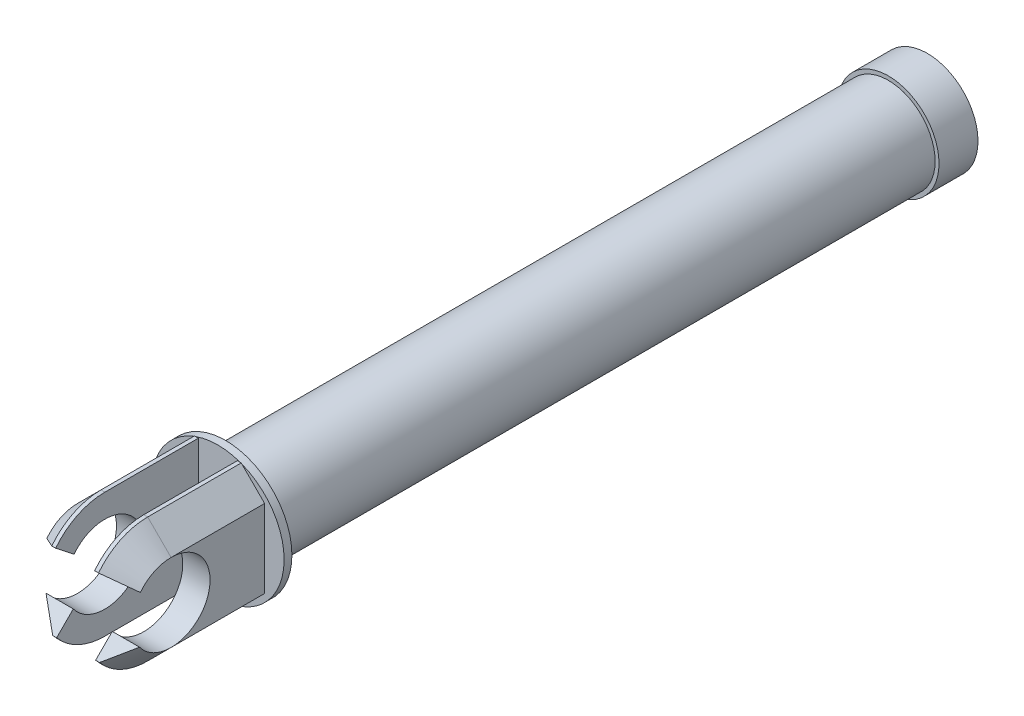
ISO-10303-21;
HEADER;
FILE_DESCRIPTION(('STEP AP214'),'2;1');
FILE_NAME('part.step','',(''),(''),'','','');
FILE_SCHEMA(('AUTOMOTIVE_DESIGN { 1 0 10303 214 1 1 1 1 }'));
ENDSEC;
DATA;
#1=APPLICATION_CONTEXT('core data for automotive mechanical design processes');
#2=APPLICATION_PROTOCOL_DEFINITION('international standard','automotive_design',2000,#1);
#3=PRODUCT_CONTEXT('',#1,'mechanical');
#4=PRODUCT('Part','Part','',(#3));
#5=PRODUCT_RELATED_PRODUCT_CATEGORY('part','',(#4));
#6=PRODUCT_DEFINITION_FORMATION('','',#4);
#7=PRODUCT_DEFINITION_CONTEXT('part definition',#1,'design');
#8=PRODUCT_DEFINITION('design','',#6,#7);
#9=PRODUCT_DEFINITION_SHAPE('','',#8);
#10=(LENGTH_UNIT() NAMED_UNIT(*) SI_UNIT(.MILLI.,.METRE.));
#11=(NAMED_UNIT(*) PLANE_ANGLE_UNIT() SI_UNIT($,.RADIAN.));
#12=(NAMED_UNIT(*) SI_UNIT($,.STERADIAN.) SOLID_ANGLE_UNIT());
#13=UNCERTAINTY_MEASURE_WITH_UNIT(LENGTH_MEASURE(1.E-05),#10,'distance_accuracy_value','');
#14=(GEOMETRIC_REPRESENTATION_CONTEXT(3) GLOBAL_UNCERTAINTY_ASSIGNED_CONTEXT((#13)) GLOBAL_UNIT_ASSIGNED_CONTEXT((#10,
#11,#12)) REPRESENTATION_CONTEXT('',''));
#15=CARTESIAN_POINT('',(0.,0.,0.));
#16=DIRECTION('',(0.,0.,1.));
#17=DIRECTION('',(1.,0.,0.));
#18=AXIS2_PLACEMENT_3D('',#15,#16,#17);
#19=CARTESIAN_POINT('',(12.,0.,206.));
#20=DIRECTION('',(-1.,0.,0.));
#21=DIRECTION('',(0.,0.,1.));
#22=AXIS2_PLACEMENT_3D('',#19,#20,#21);
#23=CYLINDRICAL_SURFACE('',#22,16.);
#24=CARTESIAN_POINT('',(4.99999999999997,0.,206.));
#25=DIRECTION('',(-1.,0.,0.));
#26=DIRECTION('',(0.,0.,1.));
#27=AXIS2_PLACEMENT_3D('',#24,#25,#26);
#28=CIRCLE('',#27,16.);
#29=CARTESIAN_POINT('',(4.99999999999997,9.85360260847751,218.605812771662));
#30=VERTEX_POINT('',#29);
#31=CARTESIAN_POINT('',(4.99999999999997,16.,206.));
#32=VERTEX_POINT('',#31);
#33=EDGE_CURVE('E397',#30,#32,#28,.T.);
#34=ORIENTED_EDGE('',*,*,#33,.F.);
#35=DIRECTION('',(1.,0.,0.));
#36=VECTOR('',#35,1.);
#37=CARTESIAN_POINT('',(-33.6006798410072,9.85360260847751,218.605812771662));
#38=LINE('',#37,#36);
#39=CARTESIAN_POINT('',(5.99999999999991,9.85360260847752,218.605812771662));
#40=VERTEX_POINT('',#39);
#41=EDGE_CURVE('E79',#30,#40,#38,.T.);
#42=ORIENTED_EDGE('',*,*,#41,.T.);
#43=CARTESIAN_POINT('',(5.99999999999997,0.,206.));
#44=DIRECTION('',(1.,0.,0.));
#45=DIRECTION('',(0.,0.,-1.));
#46=AXIS2_PLACEMENT_3D('',#43,#44,#45);
#47=CIRCLE('',#46,16.);
#48=CARTESIAN_POINT('',(5.99999999999997,16.,206.));
#49=VERTEX_POINT('',#48);
#50=EDGE_CURVE('E323',#40,#49,#47,.F.);
#51=ORIENTED_EDGE('',*,*,#50,.T.);
#52=DIRECTION('',(-1.,0.,0.));
#53=VECTOR('',#52,1.);
#54=CARTESIAN_POINT('',(12.,16.,206.));
#55=LINE('',#54,#53);
#56=EDGE_CURVE('E284',#49,#32,#55,.T.);
#57=ORIENTED_EDGE('',*,*,#56,.T.);
#58=EDGE_LOOP('',(#34,#42,#51,#57));
#59=FACE_BOUND('',#58,.T.);
#60=ADVANCED_FACE('F63',(#59),#23,.T.);
#61=CARTESIAN_POINT('',(-5.99999999999999,0.,206.));
#62=DIRECTION('',(1.,0.,0.));
#63=DIRECTION('',(0.,0.,-1.));
#64=AXIS2_PLACEMENT_3D('',#61,#62,#63);
#65=CIRCLE('',#64,16.);
#66=CARTESIAN_POINT('',(-5.99999999999999,16.,206.));
#67=VERTEX_POINT('',#66);
#68=CARTESIAN_POINT('',(-5.99999999999998,9.85360260847751,218.605812771662));
#69=VERTEX_POINT('',#68);
#70=EDGE_CURVE('E327',#67,#69,#65,.T.);
#71=ORIENTED_EDGE('',*,*,#70,.T.);
#72=CARTESIAN_POINT('',(-5.,9.85360260847751,218.605812771662));
#73=VERTEX_POINT('',#72);
#74=EDGE_CURVE('E505',#69,#73,#38,.T.);
#75=ORIENTED_EDGE('',*,*,#74,.T.);
#76=CARTESIAN_POINT('',(-5.,0.,206.));
#77=DIRECTION('',(-1.,0.,0.));
#78=DIRECTION('',(0.,0.,1.));
#79=AXIS2_PLACEMENT_3D('',#76,#77,#78);
#80=CIRCLE('',#79,16.);
#81=CARTESIAN_POINT('',(-5.,16.,206.));
#82=VERTEX_POINT('',#81);
#83=EDGE_CURVE('E390',#73,#82,#80,.T.);
#84=ORIENTED_EDGE('',*,*,#83,.T.);
#85=EDGE_CURVE('E283',#82,#67,#55,.T.);
#86=ORIENTED_EDGE('',*,*,#85,.T.);
#87=EDGE_LOOP('',(#71,#75,#84,#86));
#88=FACE_BOUND('',#87,.T.);
#89=ADVANCED_FACE('F504',(#88),#23,.T.);
#90=CARTESIAN_POINT('',(-5.99999999999999,0.,206.));
#91=DIRECTION('',(1.,0.,0.));
#92=DIRECTION('',(0.,0.,-1.));
#93=AXIS2_PLACEMENT_3D('',#90,#91,#92);
#94=CONICAL_SURFACE('',#93,16.,0.785398163397451);
#95=DIRECTION('',(0.707106781186546,0.435471826473245,0.557103480825653));
#96=VECTOR('',#95,1.);
#97=CARTESIAN_POINT('',(-21.9999999999999,0.,206.));
#98=LINE('',#97,#96);
#99=CARTESIAN_POINT('',(-12.,6.15850163029844,213.878632982289));
#100=VERTEX_POINT('',#99);
#101=EDGE_CURVE('E501',#69,#100,#98,.F.);
#102=ORIENTED_EDGE('',*,*,#101,.F.);
#103=ORIENTED_EDGE('',*,*,#70,.F.);
#104=DIRECTION('',(-0.707106781186546,-0.707106781186549,0.));
#105=VECTOR('',#104,1.);
#106=CARTESIAN_POINT('',(-5.99999999999999,16.,206.));
#107=LINE('',#106,#105);
#108=CARTESIAN_POINT('',(-12.,9.99999999999996,206.));
#109=VERTEX_POINT('',#108);
#110=EDGE_CURVE('E360',#67,#109,#107,.T.);
#111=ORIENTED_EDGE('',*,*,#110,.T.);
#112=CARTESIAN_POINT('',(-12.,0.,206.));
#113=DIRECTION('',(1.,0.,0.));
#114=DIRECTION('',(0.,0.,-1.));
#115=AXIS2_PLACEMENT_3D('',#112,#113,#114);
#116=CIRCLE('',#115,10.);
#117=EDGE_CURVE('E256',#109,#100,#116,.T.);
#118=ORIENTED_EDGE('',*,*,#117,.T.);
#119=EDGE_LOOP('',(#102,#103,#111,#118));
#120=FACE_BOUND('',#119,.T.);
#121=ADVANCED_FACE('F500',(#120),#94,.T.);
#122=CARTESIAN_POINT('',(12.,0.,206.));
#123=DIRECTION('',(-1.,0.,0.));
#124=DIRECTION('',(0.,0.,1.));
#125=AXIS2_PLACEMENT_3D('',#122,#123,#124);
#126=CONICAL_SURFACE('',#125,9.99999999999999,0.785398163397446);
#127=DIRECTION('',(0.707106781186549,-0.435471826473244,-0.55710348082565));
#128=VECTOR('',#127,1.);
#129=CARTESIAN_POINT('',(22.,0.,206.));
#130=LINE('',#129,#128);
#131=CARTESIAN_POINT('',(12.,6.15850163029844,213.878632982289));
#132=VERTEX_POINT('',#131);
#133=EDGE_CURVE('E419',#132,#40,#130,.F.);
#134=ORIENTED_EDGE('',*,*,#133,.F.);
#135=CARTESIAN_POINT('',(12.,0.,206.));
#136=DIRECTION('',(1.,0.,0.));
#137=DIRECTION('',(0.,0.,-1.));
#138=AXIS2_PLACEMENT_3D('',#135,#136,#137);
#139=CIRCLE('',#138,10.);
#140=CARTESIAN_POINT('',(12.,9.99999999999999,206.));
#141=VERTEX_POINT('',#140);
#142=EDGE_CURVE('E251',#141,#132,#139,.T.);
#143=ORIENTED_EDGE('',*,*,#142,.F.);
#144=DIRECTION('',(-0.707106781186549,0.707106781186546,0.));
#145=VECTOR('',#144,1.);
#146=CARTESIAN_POINT('',(12.,9.99999999999999,206.));
#147=LINE('',#146,#145);
#148=EDGE_CURVE('E361',#141,#49,#147,.T.);
#149=ORIENTED_EDGE('',*,*,#148,.T.);
#150=ORIENTED_EDGE('',*,*,#50,.F.);
#151=EDGE_LOOP('',(#134,#143,#149,#150));
#152=FACE_BOUND('',#151,.T.);
#153=ADVANCED_FACE('F417',(#152),#126,.T.);
#154=CARTESIAN_POINT('',(12.,16.,182.));
#155=DIRECTION('',(0.,-1.,0.));
#156=DIRECTION('',(0.,0.,-1.));
#157=AXIS2_PLACEMENT_3D('',#154,#155,#156);
#158=PLANE('',#157);
#159=DIRECTION('',(0.,0.,-1.));
#160=VECTOR('',#159,1.);
#161=CARTESIAN_POINT('',(4.99999999999996,16.,182.));
#162=LINE('',#161,#160);
#163=CARTESIAN_POINT('',(4.99999999999996,16.,182.));
#164=VERTEX_POINT('',#163);
#165=EDGE_CURVE('E259',#32,#164,#162,.T.);
#166=ORIENTED_EDGE('',*,*,#165,.F.);
#167=ORIENTED_EDGE('',*,*,#56,.F.);
#168=DIRECTION('',(0.,0.,-1.));
#169=VECTOR('',#168,1.);
#170=CARTESIAN_POINT('',(5.99999999999997,16.,182.));
#171=LINE('',#170,#169);
#172=CARTESIAN_POINT('',(5.99999999999997,16.,182.));
#173=VERTEX_POINT('',#172);
#174=EDGE_CURVE('E330',#49,#173,#171,.T.);
#175=ORIENTED_EDGE('',*,*,#174,.T.);
#176=DIRECTION('',(-1.,0.,0.));
#177=VECTOR('',#176,1.);
#178=CARTESIAN_POINT('',(12.,16.,182.));
#179=LINE('',#178,#177);
#180=CARTESIAN_POINT('',(5.74456264653805,16.,182.));
#181=VERTEX_POINT('',#180);
#182=EDGE_CURVE('E288',#173,#181,#179,.T.);
#183=ORIENTED_EDGE('',*,*,#182,.T.);
#184=EDGE_CURVE('E274',#181,#164,#179,.T.);
#185=ORIENTED_EDGE('',*,*,#184,.T.);
#186=EDGE_LOOP('',(#166,#167,#175,#183,#185));
#187=FACE_BOUND('',#186,.T.);
#188=ADVANCED_FACE('F411',(#187),#158,.F.);
#189=CARTESIAN_POINT('',(5.99999999999997,-16.,206.));
#190=VERTEX_POINT('',#189);
#191=CARTESIAN_POINT('',(5.99999999999998,-10.1622103242348,218.358376969733));
#192=VERTEX_POINT('',#191);
#193=EDGE_CURVE('E324',#190,#192,#47,.F.);
#194=ORIENTED_EDGE('',*,*,#193,.T.);
#195=DIRECTION('',(1.,0.,0.));
#196=VECTOR('',#195,1.);
#197=CARTESIAN_POINT('',(-33.6006798410072,-10.1622103242348,218.358376969733));
#198=LINE('',#197,#196);
#199=CARTESIAN_POINT('',(4.99999999999996,-10.1622103242348,218.358376969733));
#200=VERTEX_POINT('',#199);
#201=EDGE_CURVE('E226',#200,#192,#198,.T.);
#202=ORIENTED_EDGE('',*,*,#201,.F.);
#203=CARTESIAN_POINT('',(4.99999999999997,-16.,206.));
#204=VERTEX_POINT('',#203);
#205=EDGE_CURVE('E398',#204,#200,#28,.T.);
#206=ORIENTED_EDGE('',*,*,#205,.F.);
#207=DIRECTION('',(-1.,0.,0.));
#208=VECTOR('',#207,1.);
#209=CARTESIAN_POINT('',(12.,-16.,206.));
#210=LINE('',#209,#208);
#211=EDGE_CURVE('E280',#190,#204,#210,.T.);
#212=ORIENTED_EDGE('',*,*,#211,.F.);
#213=EDGE_LOOP('',(#194,#202,#206,#212));
#214=FACE_BOUND('',#213,.T.);
#215=ADVANCED_FACE('F555',(#214),#23,.T.);
#216=CARTESIAN_POINT('',(12.,-16.,206.));
#217=DIRECTION('',(0.,1.,0.));
#218=DIRECTION('',(0.,0.,1.));
#219=AXIS2_PLACEMENT_3D('',#216,#217,#218);
#220=PLANE('',#219);
#221=DIRECTION('',(0.,0.,1.));
#222=VECTOR('',#221,1.);
#223=CARTESIAN_POINT('',(4.99999999999997,-16.,206.));
#224=LINE('',#223,#222);
#225=CARTESIAN_POINT('',(4.99999999999996,-16.,182.));
#226=VERTEX_POINT('',#225);
#227=EDGE_CURVE('E372',#226,#204,#224,.T.);
#228=ORIENTED_EDGE('',*,*,#227,.F.);
#229=DIRECTION('',(-1.,0.,0.));
#230=VECTOR('',#229,1.);
#231=CARTESIAN_POINT('',(12.,-16.,182.));
#232=LINE('',#231,#230);
#233=CARTESIAN_POINT('',(5.74456264653805,-16.,182.));
#234=VERTEX_POINT('',#233);
#235=EDGE_CURVE('E269',#234,#226,#232,.T.);
#236=ORIENTED_EDGE('',*,*,#235,.F.);
#237=CARTESIAN_POINT('',(5.99999999999997,-16.,182.));
#238=VERTEX_POINT('',#237);
#239=EDGE_CURVE('E275',#238,#234,#232,.T.);
#240=ORIENTED_EDGE('',*,*,#239,.F.);
#241=DIRECTION('',(0.,0.,1.));
#242=VECTOR('',#241,1.);
#243=CARTESIAN_POINT('',(5.99999999999997,-16.,206.));
#244=LINE('',#243,#242);
#245=EDGE_CURVE('E273',#238,#190,#244,.T.);
#246=ORIENTED_EDGE('',*,*,#245,.T.);
#247=ORIENTED_EDGE('',*,*,#211,.T.);
#248=EDGE_LOOP('',(#228,#236,#240,#246,#247));
#249=FACE_BOUND('',#248,.T.);
#250=ADVANCED_FACE('F452',(#249),#220,.F.);
#251=CARTESIAN_POINT('',(12.,0.,206.));
#252=DIRECTION('',(-1.,0.,0.));
#253=DIRECTION('',(0.,0.,1.));
#254=AXIS2_PLACEMENT_3D('',#251,#252,#253);
#255=CYLINDRICAL_SURFACE('',#254,10.);
#256=DIRECTION('',(1.,0.,0.));
#257=VECTOR('',#256,1.);
#258=CARTESIAN_POINT('',(-33.6006798410072,6.15850163029844,213.878632982289));
#259=LINE('',#258,#257);
#260=CARTESIAN_POINT('',(4.99999999999996,6.15850163029844,213.878632982289));
#261=VERTEX_POINT('',#260);
#262=EDGE_CURVE('E612',#261,#132,#259,.T.);
#263=ORIENTED_EDGE('',*,*,#262,.F.);
#264=CARTESIAN_POINT('',(4.99999999999997,0.,206.));
#265=DIRECTION('',(-1.,0.,0.));
#266=DIRECTION('',(0.,0.,1.));
#267=AXIS2_PLACEMENT_3D('',#264,#265,#266);
#268=CIRCLE('',#267,10.);
#269=CARTESIAN_POINT('',(4.99999999999997,-5.88720214144661,214.083368786944));
#270=VERTEX_POINT('',#269);
#271=EDGE_CURVE('E242',#261,#270,#268,.T.);
#272=ORIENTED_EDGE('',*,*,#271,.T.);
#273=DIRECTION('',(1.,0.,0.));
#274=VECTOR('',#273,1.);
#275=CARTESIAN_POINT('',(-33.6006798410072,-5.8872021414466,214.083368786944));
#276=LINE('',#275,#274);
#277=CARTESIAN_POINT('',(12.,-5.8872021414466,214.083368786944));
#278=VERTEX_POINT('',#277);
#279=EDGE_CURVE('E87',#270,#278,#276,.T.);
#280=ORIENTED_EDGE('',*,*,#279,.T.);
#281=CARTESIAN_POINT('',(12.,-10.,206.));
#282=VERTEX_POINT('',#281);
#283=EDGE_CURVE('E239',#278,#282,#139,.T.);
#284=ORIENTED_EDGE('',*,*,#283,.T.);
#285=EDGE_CURVE('E252',#282,#141,#139,.T.);
#286=ORIENTED_EDGE('',*,*,#285,.T.);
#287=ORIENTED_EDGE('',*,*,#142,.T.);
#288=EDGE_LOOP('',(#263,#272,#280,#284,#286,#287));
#289=FACE_BOUND('',#288,.T.);
#290=ADVANCED_FACE('F237',(#289),#255,.F.);
#291=CARTESIAN_POINT('',(0.,0.,182.));
#292=DIRECTION('',(0.,0.,1.));
#293=DIRECTION('',(1.,0.,0.));
#294=AXIS2_PLACEMENT_3D('',#291,#292,#293);
#295=PLANE('',#294);
#296=CARTESIAN_POINT('',(0.,0.,182.));
#297=DIRECTION('',(0.,0.,1.));
#298=DIRECTION('',(1.,0.,0.));
#299=AXIS2_PLACEMENT_3D('',#296,#297,#298);
#300=CIRCLE('',#299,17.);
#301=CARTESIAN_POINT('',(-6.15232014258365,15.8476798574163,182.));
#302=VERTEX_POINT('',#301);
#303=CARTESIAN_POINT('',(-6.15232014258365,-15.8476798574163,182.));
#304=VERTEX_POINT('',#303);
#305=EDGE_CURVE('E459',#302,#304,#300,.T.);
#306=ORIENTED_EDGE('',*,*,#305,.T.);
#307=DIRECTION('',(0.707106781186546,-0.707106781186549,0.));
#308=VECTOR('',#307,1.);
#309=CARTESIAN_POINT('',(-5.99999999999999,-16.,182.));
#310=LINE('',#309,#308);
#311=CARTESIAN_POINT('',(-12.,-9.99999999999996,182.));
#312=VERTEX_POINT('',#311);
#313=EDGE_CURVE('E347',#304,#312,#310,.F.);
#314=ORIENTED_EDGE('',*,*,#313,.T.);
#315=DIRECTION('',(0.,1.,0.));
#316=VECTOR('',#315,1.);
#317=CARTESIAN_POINT('',(-12.,-16.,182.));
#318=LINE('',#317,#316);
#319=CARTESIAN_POINT('',(-12.,9.99999999999996,182.));
#320=VERTEX_POINT('',#319);
#321=EDGE_CURVE('E270',#312,#320,#318,.T.);
#322=ORIENTED_EDGE('',*,*,#321,.T.);
#323=DIRECTION('',(-0.707106781186546,-0.707106781186549,0.));
#324=VECTOR('',#323,1.);
#325=CARTESIAN_POINT('',(-5.99999999999999,16.,182.));
#326=LINE('',#325,#324);
#327=EDGE_CURVE('E349',#320,#302,#326,.F.);
#328=ORIENTED_EDGE('',*,*,#327,.T.);
#329=EDGE_LOOP('',(#306,#314,#322,#328));
#330=FACE_BOUND('',#329,.T.);
#331=ADVANCED_FACE('F487',(#330),#295,.T.);
#332=CARTESIAN_POINT('',(-5.74456264653805,-16.,182.));
#333=VERTEX_POINT('',#332);
#334=EDGE_CURVE('E458',#333,#234,#300,.T.);
#335=ORIENTED_EDGE('',*,*,#334,.T.);
#336=ORIENTED_EDGE('',*,*,#235,.T.);
#337=DIRECTION('',(0.,1.,0.));
#338=VECTOR('',#337,1.);
#339=CARTESIAN_POINT('',(4.99999999999996,-20.,182.));
#340=LINE('',#339,#338);
#341=EDGE_CURVE('E371',#226,#164,#340,.T.);
#342=ORIENTED_EDGE('',*,*,#341,.T.);
#343=ORIENTED_EDGE('',*,*,#184,.F.);
#344=CARTESIAN_POINT('',(-5.74456264653805,16.,182.));
#345=VERTEX_POINT('',#344);
#346=EDGE_CURVE('E295',#181,#345,#300,.T.);
#347=ORIENTED_EDGE('',*,*,#346,.T.);
#348=CARTESIAN_POINT('',(-5.,16.,182.));
#349=VERTEX_POINT('',#348);
#350=EDGE_CURVE('E268',#349,#345,#179,.T.);
#351=ORIENTED_EDGE('',*,*,#350,.F.);
#352=DIRECTION('',(0.,1.,0.));
#353=VECTOR('',#352,1.);
#354=CARTESIAN_POINT('',(-5.,-20.,182.));
#355=LINE('',#354,#353);
#356=CARTESIAN_POINT('',(-5.,-16.,182.));
#357=VERTEX_POINT('',#356);
#358=EDGE_CURVE('E506',#357,#349,#355,.T.);
#359=ORIENTED_EDGE('',*,*,#358,.F.);
#360=EDGE_CURVE('E279',#357,#333,#232,.T.);
#361=ORIENTED_EDGE('',*,*,#360,.T.);
#362=EDGE_LOOP('',(#335,#336,#342,#343,#347,#351,#359,#361));
#363=FACE_BOUND('',#362,.T.);
#364=ADVANCED_FACE('F471',(#363),#295,.T.);
#365=CARTESIAN_POINT('',(0.,0.,0.));
#366=DIRECTION('',(0.,0.,1.));
#367=DIRECTION('',(1.,0.,0.));
#368=AXIS2_PLACEMENT_3D('',#365,#366,#367);
#369=PLANE('',#368);
#370=CARTESIAN_POINT('',(0.,0.,0.));
#371=DIRECTION('',(0.,0.,1.));
#372=DIRECTION('',(1.,0.,0.));
#373=AXIS2_PLACEMENT_3D('',#370,#371,#372);
#374=CIRCLE('',#373,13.);
#375=CARTESIAN_POINT('',(13.,0.,0.));
#376=VERTEX_POINT('',#375);
#377=EDGE_CURVE('E302',#376,#376,#374,.T.);
#378=ORIENTED_EDGE('',*,*,#377,.F.);
#379=EDGE_LOOP('',(#378));
#380=FACE_BOUND('',#379,.T.);
#381=ADVANCED_FACE('F577',(#380),#369,.F.);
#382=CARTESIAN_POINT('',(0.,0.,10.));
#383=DIRECTION('',(0.,0.,-1.));
#384=DIRECTION('',(-1.,0.,0.));
#385=AXIS2_PLACEMENT_3D('',#382,#383,#384);
#386=CYLINDRICAL_SURFACE('',#385,13.);
#387=CARTESIAN_POINT('',(0.,0.,10.));
#388=DIRECTION('',(0.,0.,1.));
#389=DIRECTION('',(1.,0.,0.));
#390=AXIS2_PLACEMENT_3D('',#387,#388,#389);
#391=CIRCLE('',#390,13.);
#392=CARTESIAN_POINT('',(13.,0.,10.));
#393=VERTEX_POINT('',#392);
#394=EDGE_CURVE('E306',#393,#393,#391,.T.);
#395=ORIENTED_EDGE('',*,*,#394,.F.);
#396=EDGE_LOOP('',(#395));
#397=FACE_BOUND('',#396,.T.);
#398=ORIENTED_EDGE('',*,*,#377,.T.);
#399=EDGE_LOOP('',(#398));
#400=FACE_BOUND('',#399,.T.);
#401=ADVANCED_FACE('F575',(#397,#400),#386,.T.);
#402=CARTESIAN_POINT('',(0.,0.,10.));
#403=DIRECTION('',(0.,0.,1.));
#404=DIRECTION('',(1.,0.,0.));
#405=AXIS2_PLACEMENT_3D('',#402,#403,#404);
#406=PLANE('',#405);
#407=CARTESIAN_POINT('',(0.,0.,10.));
#408=DIRECTION('',(0.,0.,1.));
#409=DIRECTION('',(1.,0.,0.));
#410=AXIS2_PLACEMENT_3D('',#407,#408,#409);
#411=CIRCLE('',#410,12.);
#412=CARTESIAN_POINT('',(12.,0.,10.));
#413=VERTEX_POINT('',#412);
#414=EDGE_CURVE('E303',#413,#413,#411,.T.);
#415=ORIENTED_EDGE('',*,*,#414,.F.);
#416=EDGE_LOOP('',(#415));
#417=FACE_BOUND('',#416,.T.);
#418=ORIENTED_EDGE('',*,*,#394,.T.);
#419=EDGE_LOOP('',(#418));
#420=FACE_BOUND('',#419,.T.);
#421=ADVANCED_FACE('F571',(#417,#420),#406,.T.);
#422=CARTESIAN_POINT('',(0.,0.,180.));
#423=DIRECTION('',(0.,0.,-1.));
#424=DIRECTION('',(-1.,0.,0.));
#425=AXIS2_PLACEMENT_3D('',#422,#423,#424);
#426=CYLINDRICAL_SURFACE('',#425,12.);
#427=CARTESIAN_POINT('',(0.,0.,180.));
#428=DIRECTION('',(0.,0.,1.));
#429=DIRECTION('',(1.,0.,0.));
#430=AXIS2_PLACEMENT_3D('',#427,#428,#429);
#431=CIRCLE('',#430,12.);
#432=CARTESIAN_POINT('',(12.,0.,180.));
#433=VERTEX_POINT('',#432);
#434=EDGE_CURVE('E294',#433,#433,#431,.T.);
#435=ORIENTED_EDGE('',*,*,#434,.F.);
#436=EDGE_LOOP('',(#435));
#437=FACE_BOUND('',#436,.T.);
#438=ORIENTED_EDGE('',*,*,#414,.T.);
#439=EDGE_LOOP('',(#438));
#440=FACE_BOUND('',#439,.T.);
#441=ADVANCED_FACE('F568',(#437,#440),#426,.T.);
#442=CARTESIAN_POINT('',(0.,0.,182.));
#443=DIRECTION('',(0.,0.,-1.));
#444=DIRECTION('',(-1.,0.,0.));
#445=AXIS2_PLACEMENT_3D('',#442,#443,#444);
#446=CYLINDRICAL_SURFACE('',#445,17.);
#447=CARTESIAN_POINT('',(6.1523201425836,15.8476798574164,182.));
#448=VERTEX_POINT('',#447);
#449=EDGE_CURVE('E292',#448,#181,#300,.T.);
#450=ORIENTED_EDGE('',*,*,#449,.F.);
#451=CARTESIAN_POINT('',(6.1523201425836,-15.8476798574164,182.));
#452=VERTEX_POINT('',#451);
#453=EDGE_CURVE('E299',#452,#448,#300,.T.);
#454=ORIENTED_EDGE('',*,*,#453,.F.);
#455=EDGE_CURVE('E449',#234,#452,#300,.T.);
#456=ORIENTED_EDGE('',*,*,#455,.F.);
#457=ORIENTED_EDGE('',*,*,#334,.F.);
#458=EDGE_CURVE('E296',#304,#333,#300,.T.);
#459=ORIENTED_EDGE('',*,*,#458,.F.);
#460=ORIENTED_EDGE('',*,*,#305,.F.);
#461=EDGE_CURVE('E464',#345,#302,#300,.T.);
#462=ORIENTED_EDGE('',*,*,#461,.F.);
#463=ORIENTED_EDGE('',*,*,#346,.F.);
#464=EDGE_LOOP('',(#450,#454,#456,#457,#459,#460,#462,#463));
#465=FACE_BOUND('',#464,.T.);
#466=CARTESIAN_POINT('',(0.,0.,180.));
#467=DIRECTION('',(0.,0.,1.));
#468=DIRECTION('',(1.,0.,0.));
#469=AXIS2_PLACEMENT_3D('',#466,#467,#468);
#470=CIRCLE('',#469,17.);
#471=CARTESIAN_POINT('',(17.,0.,180.));
#472=VERTEX_POINT('',#471);
#473=EDGE_CURVE('E291',#472,#472,#470,.T.);
#474=ORIENTED_EDGE('',*,*,#473,.T.);
#475=EDGE_LOOP('',(#474));
#476=FACE_BOUND('',#475,.T.);
#477=ADVANCED_FACE('F431',(#465,#476),#446,.T.);
#478=DIRECTION('',(0.,1.,0.));
#479=VECTOR('',#478,1.);
#480=CARTESIAN_POINT('',(12.,-16.,182.));
#481=LINE('',#480,#479);
#482=CARTESIAN_POINT('',(12.,-9.99999999999999,182.));
#483=VERTEX_POINT('',#482);
#484=CARTESIAN_POINT('',(12.,9.99999999999999,182.));
#485=VERTEX_POINT('',#484);
#486=EDGE_CURVE('E265',#483,#485,#481,.T.);
#487=ORIENTED_EDGE('',*,*,#486,.F.);
#488=DIRECTION('',(-0.707106781186549,-0.707106781186546,0.));
#489=VECTOR('',#488,1.);
#490=CARTESIAN_POINT('',(12.,-9.99999999999999,182.));
#491=LINE('',#490,#489);
#492=EDGE_CURVE('E352',#483,#452,#491,.T.);
#493=ORIENTED_EDGE('',*,*,#492,.T.);
#494=ORIENTED_EDGE('',*,*,#453,.T.);
#495=DIRECTION('',(0.707106781186549,-0.707106781186546,0.));
#496=VECTOR('',#495,1.);
#497=CARTESIAN_POINT('',(12.,9.99999999999999,182.));
#498=LINE('',#497,#496);
#499=EDGE_CURVE('E355',#448,#485,#498,.T.);
#500=ORIENTED_EDGE('',*,*,#499,.T.);
#501=EDGE_LOOP('',(#487,#493,#494,#500));
#502=FACE_BOUND('',#501,.T.);
#503=ADVANCED_FACE('F438',(#502),#295,.T.);
#504=CARTESIAN_POINT('',(0.,0.,180.));
#505=DIRECTION('',(0.,0.,1.));
#506=DIRECTION('',(1.,0.,0.));
#507=AXIS2_PLACEMENT_3D('',#504,#505,#506);
#508=PLANE('',#507);
#509=ORIENTED_EDGE('',*,*,#434,.T.);
#510=EDGE_LOOP('',(#509));
#511=FACE_BOUND('',#510,.T.);
#512=ORIENTED_EDGE('',*,*,#473,.F.);
#513=EDGE_LOOP('',(#512));
#514=FACE_BOUND('',#513,.T.);
#515=ADVANCED_FACE('F560',(#511,#514),#508,.F.);
#516=CARTESIAN_POINT('',(12.,-16.,182.));
#517=DIRECTION('',(0.,0.,1.));
#518=DIRECTION('',(1.,0.,0.));
#519=AXIS2_PLACEMENT_3D('',#516,#517,#518);
#520=PLANE('',#519);
#521=ORIENTED_EDGE('',*,*,#182,.F.);
#522=DIRECTION('',(0.707106781186549,-0.707106781186546,0.));
#523=VECTOR('',#522,1.);
#524=CARTESIAN_POINT('',(12.,9.99999999999999,182.));
#525=LINE('',#524,#523);
#526=EDGE_CURVE('E344',#173,#448,#525,.T.);
#527=ORIENTED_EDGE('',*,*,#526,.T.);
#528=ORIENTED_EDGE('',*,*,#449,.T.);
#529=EDGE_LOOP('',(#521,#527,#528));
#530=FACE_BOUND('',#529,.T.);
#531=ADVANCED_FACE('F427',(#530),#520,.F.);
#532=ORIENTED_EDGE('',*,*,#461,.T.);
#533=DIRECTION('',(-0.707106781186546,-0.707106781186549,0.));
#534=VECTOR('',#533,1.);
#535=CARTESIAN_POINT('',(-5.99999999999999,16.,182.));
#536=LINE('',#535,#534);
#537=CARTESIAN_POINT('',(-5.99999999999999,16.,182.));
#538=VERTEX_POINT('',#537);
#539=EDGE_CURVE('E335',#302,#538,#536,.F.);
#540=ORIENTED_EDGE('',*,*,#539,.T.);
#541=EDGE_CURVE('E287',#345,#538,#179,.T.);
#542=ORIENTED_EDGE('',*,*,#541,.F.);
#543=EDGE_LOOP('',(#532,#540,#542));
#544=FACE_BOUND('',#543,.T.);
#545=ADVANCED_FACE('F479',(#544),#520,.F.);
#546=CARTESIAN_POINT('',(-5.99999999999999,-16.,182.));
#547=VERTEX_POINT('',#546);
#548=EDGE_CURVE('E255',#333,#547,#232,.T.);
#549=ORIENTED_EDGE('',*,*,#548,.T.);
#550=DIRECTION('',(0.707106781186546,-0.707106781186549,0.));
#551=VECTOR('',#550,1.);
#552=CARTESIAN_POINT('',(-5.99999999999999,-16.,182.));
#553=LINE('',#552,#551);
#554=EDGE_CURVE('E315',#547,#304,#553,.F.);
#555=ORIENTED_EDGE('',*,*,#554,.T.);
#556=ORIENTED_EDGE('',*,*,#458,.T.);
#557=EDGE_LOOP('',(#549,#555,#556));
#558=FACE_BOUND('',#557,.T.);
#559=ADVANCED_FACE('F618',(#558),#520,.F.);
#560=ORIENTED_EDGE('',*,*,#455,.T.);
#561=DIRECTION('',(-0.707106781186549,-0.707106781186546,0.));
#562=VECTOR('',#561,1.);
#563=CARTESIAN_POINT('',(12.,-9.99999999999999,182.));
#564=LINE('',#563,#562);
#565=EDGE_CURVE('E342',#452,#238,#564,.T.);
#566=ORIENTED_EDGE('',*,*,#565,.T.);
#567=ORIENTED_EDGE('',*,*,#239,.T.);
#568=EDGE_LOOP('',(#560,#566,#567));
#569=FACE_BOUND('',#568,.T.);
#570=ADVANCED_FACE('F447',(#569),#520,.F.);
#571=CARTESIAN_POINT('',(12.,0.,206.));
#572=DIRECTION('',(1.,0.,0.));
#573=DIRECTION('',(0.,0.,-1.));
#574=AXIS2_PLACEMENT_3D('',#571,#572,#573);
#575=PLANE('',#574);
#576=ORIENTED_EDGE('',*,*,#285,.F.);
#577=DIRECTION('',(0.,0.,-1.));
#578=VECTOR('',#577,1.);
#579=CARTESIAN_POINT('',(12.,-9.99999999999999,182.));
#580=LINE('',#579,#578);
#581=EDGE_CURVE('E339',#282,#483,#580,.T.);
#582=ORIENTED_EDGE('',*,*,#581,.T.);
#583=ORIENTED_EDGE('',*,*,#486,.T.);
#584=DIRECTION('',(0.,0.,1.));
#585=VECTOR('',#584,1.);
#586=CARTESIAN_POINT('',(12.,9.99999999999999,206.));
#587=LINE('',#586,#585);
#588=EDGE_CURVE('E337',#485,#141,#587,.T.);
#589=ORIENTED_EDGE('',*,*,#588,.T.);
#590=EDGE_LOOP('',(#576,#582,#583,#589));
#591=FACE_BOUND('',#590,.T.);
#592=ADVANCED_FACE('F440',(#591),#575,.T.);
#593=CARTESIAN_POINT('',(-12.,0.,206.));
#594=DIRECTION('',(1.,0.,0.));
#595=DIRECTION('',(0.,0.,-1.));
#596=AXIS2_PLACEMENT_3D('',#593,#594,#595);
#597=PLANE('',#596);
#598=ORIENTED_EDGE('',*,*,#321,.F.);
#599=DIRECTION('',(0.,0.,1.));
#600=VECTOR('',#599,1.);
#601=CARTESIAN_POINT('',(-12.,-9.99999999999996,206.));
#602=LINE('',#601,#600);
#603=CARTESIAN_POINT('',(-12.,-10.,206.));
#604=VERTEX_POINT('',#603);
#605=EDGE_CURVE('E320',#312,#604,#602,.T.);
#606=ORIENTED_EDGE('',*,*,#605,.T.);
#607=EDGE_CURVE('E264',#604,#109,#116,.T.);
#608=ORIENTED_EDGE('',*,*,#607,.T.);
#609=DIRECTION('',(0.,0.,-1.));
#610=VECTOR('',#609,1.);
#611=CARTESIAN_POINT('',(-12.,9.99999999999996,206.));
#612=LINE('',#611,#610);
#613=EDGE_CURVE('E318',#109,#320,#612,.T.);
#614=ORIENTED_EDGE('',*,*,#613,.T.);
#615=EDGE_LOOP('',(#598,#606,#608,#614));
#616=FACE_BOUND('',#615,.T.);
#617=ADVANCED_FACE('F490',(#616),#597,.F.);
#618=ORIENTED_EDGE('',*,*,#85,.F.);
#619=DIRECTION('',(0.,0.,-1.));
#620=VECTOR('',#619,1.);
#621=CARTESIAN_POINT('',(-5.,16.,182.));
#622=LINE('',#621,#620);
#623=EDGE_CURVE('E373',#82,#349,#622,.T.);
#624=ORIENTED_EDGE('',*,*,#623,.T.);
#625=ORIENTED_EDGE('',*,*,#350,.T.);
#626=ORIENTED_EDGE('',*,*,#541,.T.);
#627=DIRECTION('',(0.,0.,1.));
#628=VECTOR('',#627,1.);
#629=CARTESIAN_POINT('',(-5.99999999999999,16.,182.));
#630=LINE('',#629,#628);
#631=EDGE_CURVE('E332',#538,#67,#630,.T.);
#632=ORIENTED_EDGE('',*,*,#631,.T.);
#633=EDGE_LOOP('',(#618,#624,#625,#626,#632));
#634=FACE_BOUND('',#633,.T.);
#635=ADVANCED_FACE('F476',(#634),#158,.F.);
#636=CARTESIAN_POINT('',(-5.,-16.,206.));
#637=VERTEX_POINT('',#636);
#638=CARTESIAN_POINT('',(-5.,-10.1622103242348,218.358376969733));
#639=VERTEX_POINT('',#638);
#640=EDGE_CURVE('E379',#637,#639,#80,.T.);
#641=ORIENTED_EDGE('',*,*,#640,.T.);
#642=CARTESIAN_POINT('',(-6.,-10.1622103242348,218.358376969733));
#643=VERTEX_POINT('',#642);
#644=EDGE_CURVE('E244',#643,#639,#198,.T.);
#645=ORIENTED_EDGE('',*,*,#644,.F.);
#646=CARTESIAN_POINT('',(-5.99999999999999,-16.,206.));
#647=VERTEX_POINT('',#646);
#648=EDGE_CURVE('E326',#643,#647,#65,.T.);
#649=ORIENTED_EDGE('',*,*,#648,.T.);
#650=EDGE_CURVE('E278',#637,#647,#210,.T.);
#651=ORIENTED_EDGE('',*,*,#650,.F.);
#652=EDGE_LOOP('',(#641,#645,#649,#651));
#653=FACE_BOUND('',#652,.T.);
#654=ADVANCED_FACE('F387',(#653),#23,.T.);
#655=ORIENTED_EDGE('',*,*,#360,.F.);
#656=DIRECTION('',(0.,0.,1.));
#657=VECTOR('',#656,1.);
#658=CARTESIAN_POINT('',(-5.,-16.,206.));
#659=LINE('',#658,#657);
#660=EDGE_CURVE('E370',#357,#637,#659,.T.);
#661=ORIENTED_EDGE('',*,*,#660,.T.);
#662=ORIENTED_EDGE('',*,*,#650,.T.);
#663=DIRECTION('',(0.,0.,-1.));
#664=VECTOR('',#663,1.);
#665=CARTESIAN_POINT('',(-5.99999999999999,-16.,206.));
#666=LINE('',#665,#664);
#667=EDGE_CURVE('E312',#647,#547,#666,.T.);
#668=ORIENTED_EDGE('',*,*,#667,.T.);
#669=ORIENTED_EDGE('',*,*,#548,.F.);
#670=EDGE_LOOP('',(#655,#661,#662,#668,#669));
#671=FACE_BOUND('',#670,.T.);
#672=ADVANCED_FACE('F544',(#671),#220,.F.);
#673=CARTESIAN_POINT('',(-5.,6.15850163029844,213.878632982289));
#674=VERTEX_POINT('',#673);
#675=EDGE_CURVE('E611',#100,#674,#259,.T.);
#676=ORIENTED_EDGE('',*,*,#675,.F.);
#677=ORIENTED_EDGE('',*,*,#117,.F.);
#678=ORIENTED_EDGE('',*,*,#607,.F.);
#679=CARTESIAN_POINT('',(-12.,-5.8872021414466,214.083368786944));
#680=VERTEX_POINT('',#679);
#681=EDGE_CURVE('E263',#680,#604,#116,.T.);
#682=ORIENTED_EDGE('',*,*,#681,.F.);
#683=CARTESIAN_POINT('',(-5.,-5.8872021414466,214.083368786944));
#684=VERTEX_POINT('',#683);
#685=EDGE_CURVE('E243',#680,#684,#276,.T.);
#686=ORIENTED_EDGE('',*,*,#685,.T.);
#687=CARTESIAN_POINT('',(-5.,0.,206.));
#688=DIRECTION('',(-1.,0.,0.));
#689=DIRECTION('',(0.,0.,1.));
#690=AXIS2_PLACEMENT_3D('',#687,#688,#689);
#691=CIRCLE('',#690,10.);
#692=EDGE_CURVE('E367',#674,#684,#691,.T.);
#693=ORIENTED_EDGE('',*,*,#692,.F.);
#694=EDGE_LOOP('',(#676,#677,#678,#682,#686,#693));
#695=FACE_BOUND('',#694,.T.);
#696=ADVANCED_FACE('F541',(#695),#255,.F.);
#697=CARTESIAN_POINT('',(-5.99999999999999,16.,182.));
#698=DIRECTION('',(0.707106781186549,-0.707106781186546,0.));
#699=DIRECTION('',(0.,0.,1.));
#700=AXIS2_PLACEMENT_3D('',#697,#698,#699);
#701=PLANE('',#700);
#702=ORIENTED_EDGE('',*,*,#327,.F.);
#703=ORIENTED_EDGE('',*,*,#613,.F.);
#704=ORIENTED_EDGE('',*,*,#110,.F.);
#705=ORIENTED_EDGE('',*,*,#631,.F.);
#706=ORIENTED_EDGE('',*,*,#539,.F.);
#707=EDGE_LOOP('',(#702,#703,#704,#705,#706));
#708=FACE_BOUND('',#707,.T.);
#709=ADVANCED_FACE('F496',(#708),#701,.F.);
#710=CARTESIAN_POINT('',(-12.0002,-5.88705898333911,214.083225628837));
#711=CARTESIAN_POINT('',(-11.5013041532222,-6.24413097801731,214.440297623515));
#712=CARTESIAN_POINT('',(-11.0019910180589,-6.6009110285319,214.79707767403));
#713=CARTESIAN_POINT('',(-10.0027436315538,-7.31403545743507,215.510202102933));
#714=CARTESIAN_POINT('',(-9.502809380715,-7.67037983617592,215.866546481674));
#715=CARTESIAN_POINT('',(-8.50253266282121,-8.38278153888671,216.578948184385));
#716=CARTESIAN_POINT('',(-8.00219019596824,-8.73883886299853,216.935005508496));
#717=CARTESIAN_POINT('',(-7.00119902357331,-9.45073878605511,217.646905431553));
#718=CARTESIAN_POINT('',(-6.50055031778985,-9.8065813848301,218.002748030328));
#719=CARTESIAN_POINT('',(-5.9998,-10.1623524164355,218.358519061933));
#720=B_SPLINE_CURVE_WITH_KNOTS('',3,(#710,#711,#712,#713,#714,#715,#716,#717,#718,#719),
.UNSPECIFIED.,.F.,.F.,(4,2,2,2,4),(0.,2.12957209797535,4.25914247293175,6.38871179462386,
8.51828279792419),.UNSPECIFIED.);
#721=EDGE_CURVE('E231',#680,#643,#720,.T.);
#722=ORIENTED_EDGE('',*,*,#721,.F.);
#723=ORIENTED_EDGE('',*,*,#681,.T.);
#724=DIRECTION('',(-0.707106781186546,0.707106781186549,0.));
#725=VECTOR('',#724,1.);
#726=CARTESIAN_POINT('',(-5.99999999999999,-16.,206.));
#727=LINE('',#726,#725);
#728=EDGE_CURVE('E357',#647,#604,#727,.T.);
#729=ORIENTED_EDGE('',*,*,#728,.F.);
#730=ORIENTED_EDGE('',*,*,#648,.F.);
#731=EDGE_LOOP('',(#722,#723,#729,#730));
#732=FACE_BOUND('',#731,.T.);
#733=ADVANCED_FACE('F525',(#732),#94,.T.);
#734=CARTESIAN_POINT('',(-5.99999999999999,-16.,206.));
#735=DIRECTION('',(0.707106781186549,0.707106781186546,0.));
#736=DIRECTION('',(0.,0.,-1.));
#737=AXIS2_PLACEMENT_3D('',#734,#735,#736);
#738=PLANE('',#737);
#739=ORIENTED_EDGE('',*,*,#728,.T.);
#740=ORIENTED_EDGE('',*,*,#605,.F.);
#741=ORIENTED_EDGE('',*,*,#313,.F.);
#742=ORIENTED_EDGE('',*,*,#554,.F.);
#743=ORIENTED_EDGE('',*,*,#667,.F.);
#744=EDGE_LOOP('',(#739,#740,#741,#742,#743));
#745=FACE_BOUND('',#744,.T.);
#746=ADVANCED_FACE('F484',(#745),#738,.F.);
#747=CARTESIAN_POINT('',(12.,9.99999999999999,206.));
#748=DIRECTION('',(0.707106781186546,0.707106781186549,0.));
#749=DIRECTION('',(0.,0.,-1.));
#750=AXIS2_PLACEMENT_3D('',#747,#748,#749);
#751=PLANE('',#750);
#752=ORIENTED_EDGE('',*,*,#526,.F.);
#753=ORIENTED_EDGE('',*,*,#174,.F.);
#754=ORIENTED_EDGE('',*,*,#148,.F.);
#755=ORIENTED_EDGE('',*,*,#588,.F.);
#756=ORIENTED_EDGE('',*,*,#499,.F.);
#757=EDGE_LOOP('',(#752,#753,#754,#755,#756));
#758=FACE_BOUND('',#757,.T.);
#759=ADVANCED_FACE('F66',(#758),#751,.T.);
#760=CARTESIAN_POINT('',(5.99979999999997,-10.1623524164355,218.358519061933));
#761=CARTESIAN_POINT('',(6.50055031778983,-9.8065813848301,218.002748030328));
#762=CARTESIAN_POINT('',(7.00119902357329,-9.45073878605511,217.646905431553));
#763=CARTESIAN_POINT('',(8.00219019596823,-8.73883886299853,216.935005508496));
#764=CARTESIAN_POINT('',(8.5025326628212,-8.38278153888671,216.578948184385));
#765=CARTESIAN_POINT('',(9.502809380715,-7.67037983617592,215.866546481674));
#766=CARTESIAN_POINT('',(10.0027436315538,-7.31403545743507,215.510202102933));
#767=CARTESIAN_POINT('',(11.0019910180589,-6.6009110285319,214.79707767403));
#768=CARTESIAN_POINT('',(11.5013041532223,-6.24413097801731,214.440297623515));
#769=CARTESIAN_POINT('',(12.0002,-5.88705898333912,214.083225628837));
#770=B_SPLINE_CURVE_WITH_KNOTS('',3,(#760,#761,#762,#763,#764,#765,#766,#767,#768,#769),
.UNSPECIFIED.,.F.,.F.,(4,2,2,2,4),(0.,2.12957100330034,4.25914032499246,6.38871069994886,
8.51828279792422),.UNSPECIFIED.);
#771=EDGE_CURVE('E223',#192,#278,#770,.T.);
#772=ORIENTED_EDGE('',*,*,#771,.F.);
#773=ORIENTED_EDGE('',*,*,#193,.F.);
#774=DIRECTION('',(-0.707106781186549,-0.707106781186546,0.));
#775=VECTOR('',#774,1.);
#776=CARTESIAN_POINT('',(12.,-9.99999999999999,206.));
#777=LINE('',#776,#775);
#778=EDGE_CURVE('E249',#282,#190,#777,.T.);
#779=ORIENTED_EDGE('',*,*,#778,.F.);
#780=ORIENTED_EDGE('',*,*,#283,.F.);
#781=EDGE_LOOP('',(#772,#773,#779,#780));
#782=FACE_BOUND('',#781,.T.);
#783=ADVANCED_FACE('F247',(#782),#126,.T.);
#784=CARTESIAN_POINT('',(12.,-9.99999999999999,206.));
#785=DIRECTION('',(0.707106781186546,-0.707106781186549,0.));
#786=DIRECTION('',(0.,0.,1.));
#787=AXIS2_PLACEMENT_3D('',#784,#785,#786);
#788=PLANE('',#787);
#789=ORIENTED_EDGE('',*,*,#778,.T.);
#790=ORIENTED_EDGE('',*,*,#245,.F.);
#791=ORIENTED_EDGE('',*,*,#565,.F.);
#792=ORIENTED_EDGE('',*,*,#492,.F.);
#793=ORIENTED_EDGE('',*,*,#581,.F.);
#794=EDGE_LOOP('',(#789,#790,#791,#792,#793));
#795=FACE_BOUND('',#794,.T.);
#796=ADVANCED_FACE('F442',(#795),#788,.T.);
#797=CARTESIAN_POINT('',(4.99999999999996,-20.,182.));
#798=DIRECTION('',(-1.,0.,0.));
#799=DIRECTION('',(0.,0.,1.));
#800=AXIS2_PLACEMENT_3D('',#797,#798,#799);
#801=PLANE('',#800);
#802=DIRECTION('',(0.,-0.615850163029845,-0.787863298228895));
#803=VECTOR('',#802,1.);
#804=CARTESIAN_POINT('',(4.99999999999996,-19.2303662419057,181.398399346103));
#805=LINE('',#804,#803);
#806=EDGE_CURVE('E406',#30,#261,#805,.T.);
#807=ORIENTED_EDGE('',*,*,#806,.F.);
#808=ORIENTED_EDGE('',*,*,#33,.T.);
#809=ORIENTED_EDGE('',*,*,#165,.T.);
#810=ORIENTED_EDGE('',*,*,#341,.F.);
#811=ORIENTED_EDGE('',*,*,#227,.T.);
#812=ORIENTED_EDGE('',*,*,#205,.T.);
#813=DIRECTION('',(0.,-0.707106781186548,0.707106781186547));
#814=VECTOR('',#813,1.);
#815=CARTESIAN_POINT('',(4.99999999999997,3.09808332274887,205.098083322749));
#816=LINE('',#815,#814);
#817=EDGE_CURVE('E232',#270,#200,#816,.T.);
#818=ORIENTED_EDGE('',*,*,#817,.F.);
#819=ORIENTED_EDGE('',*,*,#271,.F.);
#820=EDGE_LOOP('',(#807,#808,#809,#810,#811,#812,#818,#819));
#821=FACE_BOUND('',#820,.T.);
#822=ADVANCED_FACE('F404',(#821),#801,.T.);
#823=CARTESIAN_POINT('',(-5.,-20.,182.));
#824=DIRECTION('',(-1.,0.,0.));
#825=DIRECTION('',(0.,0.,1.));
#826=AXIS2_PLACEMENT_3D('',#823,#824,#825);
#827=PLANE('',#826);
#828=ORIENTED_EDGE('',*,*,#83,.F.);
#829=DIRECTION('',(0.,-0.615850163029845,-0.787863298228895));
#830=VECTOR('',#829,1.);
#831=CARTESIAN_POINT('',(-5.,-19.2303662419057,181.398399346103));
#832=LINE('',#831,#830);
#833=EDGE_CURVE('E12',#73,#674,#832,.T.);
#834=ORIENTED_EDGE('',*,*,#833,.T.);
#835=ORIENTED_EDGE('',*,*,#692,.T.);
#836=DIRECTION('',(0.,-0.707106781186548,0.707106781186547));
#837=VECTOR('',#836,1.);
#838=CARTESIAN_POINT('',(-5.,3.09808332274887,205.098083322749));
#839=LINE('',#838,#837);
#840=EDGE_CURVE('E72',#684,#639,#839,.T.);
#841=ORIENTED_EDGE('',*,*,#840,.T.);
#842=ORIENTED_EDGE('',*,*,#640,.F.);
#843=ORIENTED_EDGE('',*,*,#660,.F.);
#844=ORIENTED_EDGE('',*,*,#358,.T.);
#845=ORIENTED_EDGE('',*,*,#623,.F.);
#846=EDGE_LOOP('',(#828,#834,#835,#841,#842,#843,#844,#845));
#847=FACE_BOUND('',#846,.T.);
#848=ADVANCED_FACE('F378',(#847),#827,.F.);
#849=CARTESIAN_POINT('',(-33.6006798410072,-5.8872021414466,214.083368786944));
#850=DIRECTION('',(0.,-0.707106781186547,-0.707106781186548));
#851=DIRECTION('',(0.,0.707106781186548,-0.707106781186547));
#852=AXIS2_PLACEMENT_3D('',#849,#850,#851);
#853=PLANE('',#852);
#854=ORIENTED_EDGE('',*,*,#721,.T.);
#855=ORIENTED_EDGE('',*,*,#644,.T.);
#856=ORIENTED_EDGE('',*,*,#840,.F.);
#857=ORIENTED_EDGE('',*,*,#685,.F.);
#858=EDGE_LOOP('',(#854,#855,#856,#857));
#859=FACE_BOUND('',#858,.T.);
#860=ADVANCED_FACE('F535',(#859),#853,.F.);
#861=CARTESIAN_POINT('',(-33.6006798410072,9.85360260847751,218.605812771662));
#862=DIRECTION('',(0.,0.787863298228895,-0.615850163029845));
#863=DIRECTION('',(0.,0.615850163029845,0.787863298228895));
#864=AXIS2_PLACEMENT_3D('',#861,#862,#863);
#865=PLANE('',#864);
#866=ORIENTED_EDGE('',*,*,#101,.T.);
#867=ORIENTED_EDGE('',*,*,#675,.T.);
#868=ORIENTED_EDGE('',*,*,#833,.F.);
#869=ORIENTED_EDGE('',*,*,#74,.F.);
#870=EDGE_LOOP('',(#866,#867,#868,#869));
#871=FACE_BOUND('',#870,.T.);
#872=ADVANCED_FACE('F534',(#871),#865,.F.);
#873=ORIENTED_EDGE('',*,*,#771,.T.);
#874=ORIENTED_EDGE('',*,*,#279,.F.);
#875=ORIENTED_EDGE('',*,*,#817,.T.);
#876=ORIENTED_EDGE('',*,*,#201,.T.);
#877=EDGE_LOOP('',(#873,#874,#875,#876));
#878=FACE_BOUND('',#877,.T.);
#879=ADVANCED_FACE('F224',(#878),#853,.F.);
#880=ORIENTED_EDGE('',*,*,#133,.T.);
#881=ORIENTED_EDGE('',*,*,#41,.F.);
#882=ORIENTED_EDGE('',*,*,#806,.T.);
#883=ORIENTED_EDGE('',*,*,#262,.T.);
#884=EDGE_LOOP('',(#880,#881,#882,#883));
#885=FACE_BOUND('',#884,.T.);
#886=ADVANCED_FACE('F533',(#885),#865,.F.);
#887=CLOSED_SHELL('',(#60,#89,#121,#153,#188,#215,#250,#290,#331,#364,#381,#401,#421,#441,#477,
#503,#515,#531,#545,#559,#570,#592,#617,#635,#654,#672,#696,#709,#733,#746,#759,#783,#796,#822,
#848,#860,#872,#879,#886));
#888=MANIFOLD_SOLID_BREP('B2',#887);
#889=ADVANCED_BREP_SHAPE_REPRESENTATION('',(#18,#888),#14);
#890=SHAPE_DEFINITION_REPRESENTATION(#9,#889);
ENDSEC;
END-ISO-10303-21;
